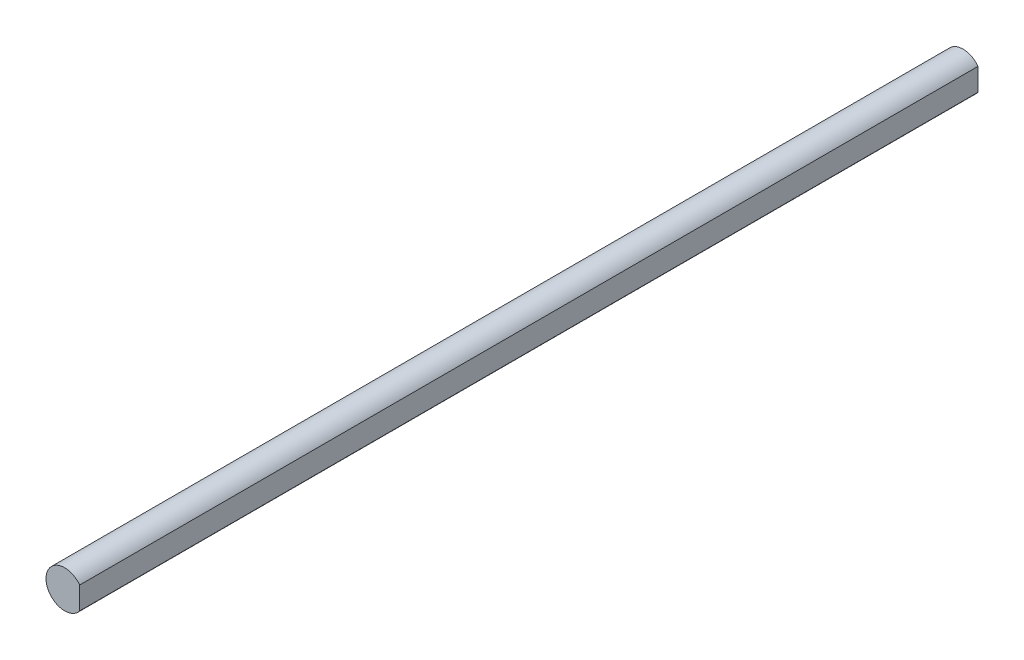
ISO-10303-21;
HEADER;
FILE_DESCRIPTION(('STEP AP214'),'2;1');
FILE_NAME('part.step','',(''),(''),'','','');
FILE_SCHEMA(('AUTOMOTIVE_DESIGN { 1 0 10303 214 1 1 1 1 }'));
ENDSEC;
DATA;
#1=APPLICATION_CONTEXT('core data for automotive mechanical design processes');
#2=APPLICATION_PROTOCOL_DEFINITION('international standard','automotive_design',2000,#1);
#3=PRODUCT_CONTEXT('',#1,'mechanical');
#4=PRODUCT('Part','Part','',(#3));
#5=PRODUCT_RELATED_PRODUCT_CATEGORY('part','',(#4));
#6=PRODUCT_DEFINITION_FORMATION('','',#4);
#7=PRODUCT_DEFINITION_CONTEXT('part definition',#1,'design');
#8=PRODUCT_DEFINITION('design','',#6,#7);
#9=PRODUCT_DEFINITION_SHAPE('','',#8);
#10=(LENGTH_UNIT() NAMED_UNIT(*) SI_UNIT(.MILLI.,.METRE.));
#11=(NAMED_UNIT(*) PLANE_ANGLE_UNIT() SI_UNIT($,.RADIAN.));
#12=(NAMED_UNIT(*) SI_UNIT($,.STERADIAN.) SOLID_ANGLE_UNIT());
#13=UNCERTAINTY_MEASURE_WITH_UNIT(LENGTH_MEASURE(1.E-05),#10,'distance_accuracy_value','');
#14=(GEOMETRIC_REPRESENTATION_CONTEXT(3) GLOBAL_UNCERTAINTY_ASSIGNED_CONTEXT((#13)) GLOBAL_UNIT_ASSIGNED_CONTEXT((#10,
#11,#12)) REPRESENTATION_CONTEXT('',''));
#15=CARTESIAN_POINT('',(0.,0.,0.));
#16=DIRECTION('',(0.,0.,1.));
#17=DIRECTION('',(1.,0.,0.));
#18=AXIS2_PLACEMENT_3D('',#15,#16,#17);
#19=CARTESIAN_POINT('',(0.,0.,152.4));
#20=DIRECTION('',(0.,0.,-1.));
#21=DIRECTION('',(-1.,0.,0.));
#22=AXIS2_PLACEMENT_3D('',#19,#20,#21);
#23=CYLINDRICAL_SURFACE('',#22,3.175);
#24=CARTESIAN_POINT('',(0.,0.,152.4));
#25=DIRECTION('',(0.,0.,1.));
#26=DIRECTION('',(1.,0.,0.));
#27=AXIS2_PLACEMENT_3D('',#24,#25,#26);
#28=CIRCLE('',#27,3.175);
#29=CARTESIAN_POINT('',(2.54,1.905,152.4));
#30=VERTEX_POINT('',#29);
#31=CARTESIAN_POINT('',(2.54,-1.905,152.4));
#32=VERTEX_POINT('',#31);
#33=EDGE_CURVE('E12',#30,#32,#28,.T.);
#34=ORIENTED_EDGE('',*,*,#33,.F.);
#35=DIRECTION('',(0.,0.,-1.));
#36=VECTOR('',#35,1.);
#37=CARTESIAN_POINT('',(2.54,1.905,152.4));
#38=LINE('',#37,#36);
#39=CARTESIAN_POINT('',(2.54,1.905,0.));
#40=VERTEX_POINT('',#39);
#41=EDGE_CURVE('E75',#40,#30,#38,.F.);
#42=ORIENTED_EDGE('',*,*,#41,.F.);
#43=CARTESIAN_POINT('',(0.,0.,0.));
#44=DIRECTION('',(0.,0.,1.));
#45=DIRECTION('',(1.,0.,0.));
#46=AXIS2_PLACEMENT_3D('',#43,#44,#45);
#47=CIRCLE('',#46,3.175);
#48=CARTESIAN_POINT('',(2.54,-1.905,0.));
#49=VERTEX_POINT('',#48);
#50=EDGE_CURVE('E49',#40,#49,#47,.T.);
#51=ORIENTED_EDGE('',*,*,#50,.T.);
#52=DIRECTION('',(0.,0.,-1.));
#53=VECTOR('',#52,1.);
#54=CARTESIAN_POINT('',(2.54,-1.905,152.4));
#55=LINE('',#54,#53);
#56=EDGE_CURVE('E64',#32,#49,#55,.T.);
#57=ORIENTED_EDGE('',*,*,#56,.F.);
#58=EDGE_LOOP('',(#34,#42,#51,#57));
#59=FACE_BOUND('',#58,.T.);
#60=ADVANCED_FACE('F45',(#59),#23,.T.);
#61=CARTESIAN_POINT('',(0.,0.,152.4));
#62=DIRECTION('',(0.,0.,1.));
#63=DIRECTION('',(1.,0.,0.));
#64=AXIS2_PLACEMENT_3D('',#61,#62,#63);
#65=PLANE('',#64);
#66=DIRECTION('',(0.,1.,0.));
#67=VECTOR('',#66,1.);
#68=CARTESIAN_POINT('',(2.54,2.49471007323309,152.4));
#69=LINE('',#68,#67);
#70=EDGE_CURVE('E78',#32,#30,#69,.T.);
#71=ORIENTED_EDGE('',*,*,#70,.T.);
#72=ORIENTED_EDGE('',*,*,#33,.T.);
#73=EDGE_LOOP('',(#71,#72));
#74=FACE_BOUND('',#73,.T.);
#75=ADVANCED_FACE('F86',(#74),#65,.T.);
#76=CARTESIAN_POINT('',(0.,0.,0.));
#77=DIRECTION('',(0.,0.,1.));
#78=DIRECTION('',(1.,0.,0.));
#79=AXIS2_PLACEMENT_3D('',#76,#77,#78);
#80=PLANE('',#79);
#81=ORIENTED_EDGE('',*,*,#50,.F.);
#82=DIRECTION('',(0.,1.,0.));
#83=VECTOR('',#82,1.);
#84=CARTESIAN_POINT('',(2.54,2.49471007323309,0.));
#85=LINE('',#84,#83);
#86=EDGE_CURVE('E69',#49,#40,#85,.T.);
#87=ORIENTED_EDGE('',*,*,#86,.F.);
#88=EDGE_LOOP('',(#81,#87));
#89=FACE_BOUND('',#88,.T.);
#90=ADVANCED_FACE('F101',(#89),#80,.F.);
#91=CARTESIAN_POINT('',(2.54,2.49471007323309,152.401));
#92=DIRECTION('',(-1.,0.,0.));
#93=DIRECTION('',(0.,-1.,0.));
#94=AXIS2_PLACEMENT_3D('',#91,#92,#93);
#95=PLANE('',#94);
#96=ORIENTED_EDGE('',*,*,#41,.T.);
#97=ORIENTED_EDGE('',*,*,#70,.F.);
#98=ORIENTED_EDGE('',*,*,#56,.T.);
#99=ORIENTED_EDGE('',*,*,#86,.T.);
#100=EDGE_LOOP('',(#96,#97,#98,#99));
#101=FACE_BOUND('',#100,.T.);
#102=ADVANCED_FACE('F77',(#101),#95,.F.);
#103=CLOSED_SHELL('',(#60,#75,#90,#102));
#104=MANIFOLD_SOLID_BREP('B2',#103);
#105=ADVANCED_BREP_SHAPE_REPRESENTATION('',(#18,#104),#14);
#106=SHAPE_DEFINITION_REPRESENTATION(#9,#105);
ENDSEC;
END-ISO-10303-21;
